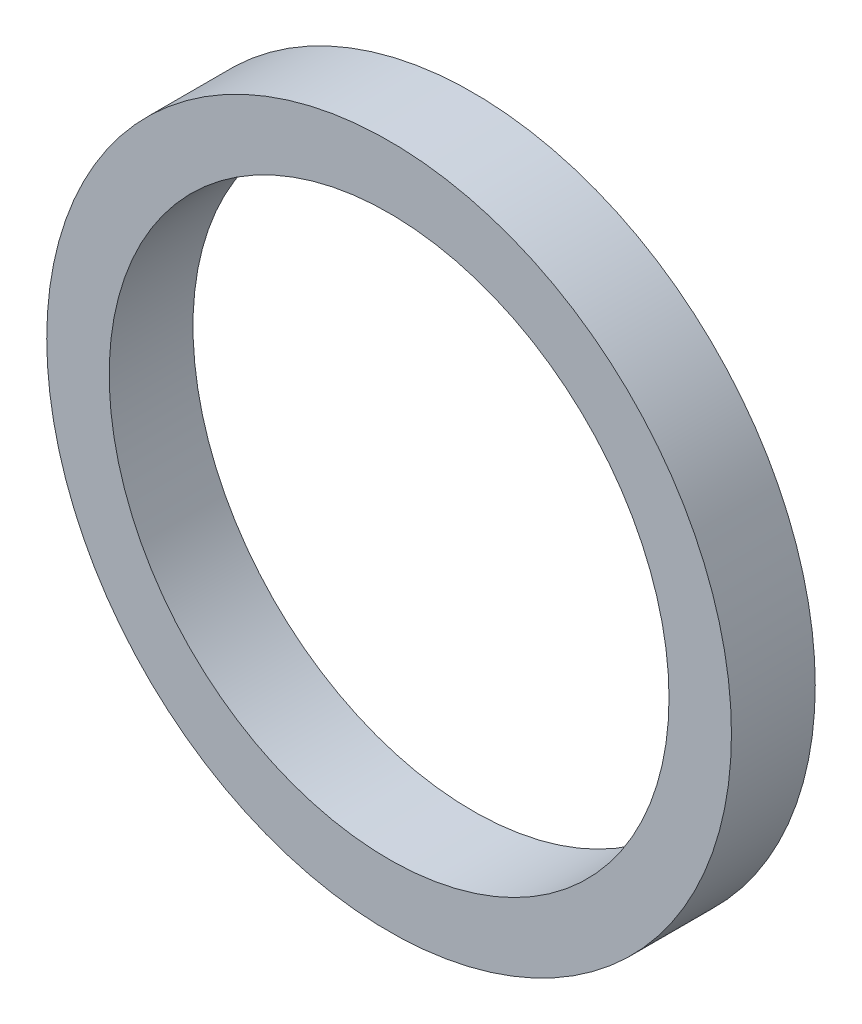
ISO-10303-21;
HEADER;
FILE_DESCRIPTION(('STEP AP214'),'2;1');
FILE_NAME('part.step','',(''),(''),'','','');
FILE_SCHEMA(('AUTOMOTIVE_DESIGN { 1 0 10303 214 1 1 1 1 }'));
ENDSEC;
DATA;
#1=APPLICATION_CONTEXT('core data for automotive mechanical design processes');
#2=APPLICATION_PROTOCOL_DEFINITION('international standard','automotive_design',2000,#1);
#3=PRODUCT_CONTEXT('',#1,'mechanical');
#4=PRODUCT('Part','Part','',(#3));
#5=PRODUCT_RELATED_PRODUCT_CATEGORY('part','',(#4));
#6=PRODUCT_DEFINITION_FORMATION('','',#4);
#7=PRODUCT_DEFINITION_CONTEXT('part definition',#1,'design');
#8=PRODUCT_DEFINITION('design','',#6,#7);
#9=PRODUCT_DEFINITION_SHAPE('','',#8);
#10=(LENGTH_UNIT() NAMED_UNIT(*) SI_UNIT(.MILLI.,.METRE.));
#11=(NAMED_UNIT(*) PLANE_ANGLE_UNIT() SI_UNIT($,.RADIAN.));
#12=(NAMED_UNIT(*) SI_UNIT($,.STERADIAN.) SOLID_ANGLE_UNIT());
#13=UNCERTAINTY_MEASURE_WITH_UNIT(LENGTH_MEASURE(1.E-05),#10,'distance_accuracy_value','');
#14=(GEOMETRIC_REPRESENTATION_CONTEXT(3) GLOBAL_UNCERTAINTY_ASSIGNED_CONTEXT((#13)) GLOBAL_UNIT_ASSIGNED_CONTEXT((#10,
#11,#12)) REPRESENTATION_CONTEXT('',''));
#15=CARTESIAN_POINT('',(0.,0.,0.));
#16=DIRECTION('',(0.,0.,1.));
#17=DIRECTION('',(1.,0.,0.));
#18=AXIS2_PLACEMENT_3D('',#15,#16,#17);
#19=CARTESIAN_POINT('',(0.,0.,1.));
#20=DIRECTION('',(0.,0.,1.));
#21=DIRECTION('',(1.,0.,0.));
#22=AXIS2_PLACEMENT_3D('',#19,#20,#21);
#23=PLANE('',#22);
#24=CARTESIAN_POINT('',(0.,0.,1.));
#25=DIRECTION('',(0.,0.,1.));
#26=DIRECTION('',(1.,0.,0.));
#27=AXIS2_PLACEMENT_3D('',#24,#25,#26);
#28=CIRCLE('',#27,3.34);
#29=CARTESIAN_POINT('',(3.34,0.,1.));
#30=VERTEX_POINT('',#29);
#31=EDGE_CURVE('E27',#30,#30,#28,.F.);
#32=ORIENTED_EDGE('',*,*,#31,.T.);
#33=EDGE_LOOP('',(#32));
#34=FACE_BOUND('',#33,.T.);
#35=CARTESIAN_POINT('',(0.,0.,1.));
#36=DIRECTION('',(0.,0.,1.));
#37=DIRECTION('',(1.,0.,0.));
#38=AXIS2_PLACEMENT_3D('',#35,#36,#37);
#39=CIRCLE('',#38,4.085);
#40=CARTESIAN_POINT('',(4.085,0.,1.));
#41=VERTEX_POINT('',#40);
#42=EDGE_CURVE('E18',#41,#41,#39,.F.);
#43=ORIENTED_EDGE('',*,*,#42,.F.);
#44=EDGE_LOOP('',(#43));
#45=FACE_BOUND('',#44,.T.);
#46=ADVANCED_FACE('F15',(#34,#45),#23,.T.);
#47=CARTESIAN_POINT('',(0.,0.,0.));
#48=DIRECTION('',(0.,0.,1.));
#49=DIRECTION('',(1.,0.,0.));
#50=AXIS2_PLACEMENT_3D('',#47,#48,#49);
#51=CYLINDRICAL_SURFACE('',#50,4.085);
#52=ORIENTED_EDGE('',*,*,#42,.T.);
#53=EDGE_LOOP('',(#52));
#54=FACE_BOUND('',#53,.T.);
#55=CARTESIAN_POINT('',(0.,0.,0.));
#56=DIRECTION('',(0.,0.,1.));
#57=DIRECTION('',(1.,0.,0.));
#58=AXIS2_PLACEMENT_3D('',#55,#56,#57);
#59=CIRCLE('',#58,4.085);
#60=CARTESIAN_POINT('',(4.085,0.,0.));
#61=VERTEX_POINT('',#60);
#62=EDGE_CURVE('E22',#61,#61,#59,.T.);
#63=ORIENTED_EDGE('',*,*,#62,.T.);
#64=EDGE_LOOP('',(#63));
#65=FACE_BOUND('',#64,.T.);
#66=ADVANCED_FACE('F35',(#54,#65),#51,.T.);
#67=CARTESIAN_POINT('',(0.,0.,0.));
#68=DIRECTION('',(0.,0.,1.));
#69=DIRECTION('',(1.,0.,0.));
#70=AXIS2_PLACEMENT_3D('',#67,#68,#69);
#71=CYLINDRICAL_SURFACE('',#70,3.34);
#72=ORIENTED_EDGE('',*,*,#31,.F.);
#73=EDGE_LOOP('',(#72));
#74=FACE_BOUND('',#73,.T.);
#75=CARTESIAN_POINT('',(0.,0.,0.));
#76=DIRECTION('',(0.,0.,1.));
#77=DIRECTION('',(1.,0.,0.));
#78=AXIS2_PLACEMENT_3D('',#75,#76,#77);
#79=CIRCLE('',#78,3.34);
#80=CARTESIAN_POINT('',(3.34,0.,0.));
#81=VERTEX_POINT('',#80);
#82=EDGE_CURVE('E10',#81,#81,#79,.F.);
#83=ORIENTED_EDGE('',*,*,#82,.T.);
#84=EDGE_LOOP('',(#83));
#85=FACE_BOUND('',#84,.T.);
#86=ADVANCED_FACE('F43',(#74,#85),#71,.F.);
#87=CARTESIAN_POINT('',(0.,0.,0.));
#88=DIRECTION('',(0.,0.,1.));
#89=DIRECTION('',(1.,0.,0.));
#90=AXIS2_PLACEMENT_3D('',#87,#88,#89);
#91=PLANE('',#90);
#92=ORIENTED_EDGE('',*,*,#82,.F.);
#93=EDGE_LOOP('',(#92));
#94=FACE_BOUND('',#93,.T.);
#95=ORIENTED_EDGE('',*,*,#62,.F.);
#96=EDGE_LOOP('',(#95));
#97=FACE_BOUND('',#96,.T.);
#98=ADVANCED_FACE('F44',(#94,#97),#91,.F.);
#99=CLOSED_SHELL('',(#46,#66,#86,#98));
#100=MANIFOLD_SOLID_BREP('B1',#99);
#101=ADVANCED_BREP_SHAPE_REPRESENTATION('',(#18,#100),#14);
#102=SHAPE_DEFINITION_REPRESENTATION(#9,#101);
ENDSEC;
END-ISO-10303-21;
